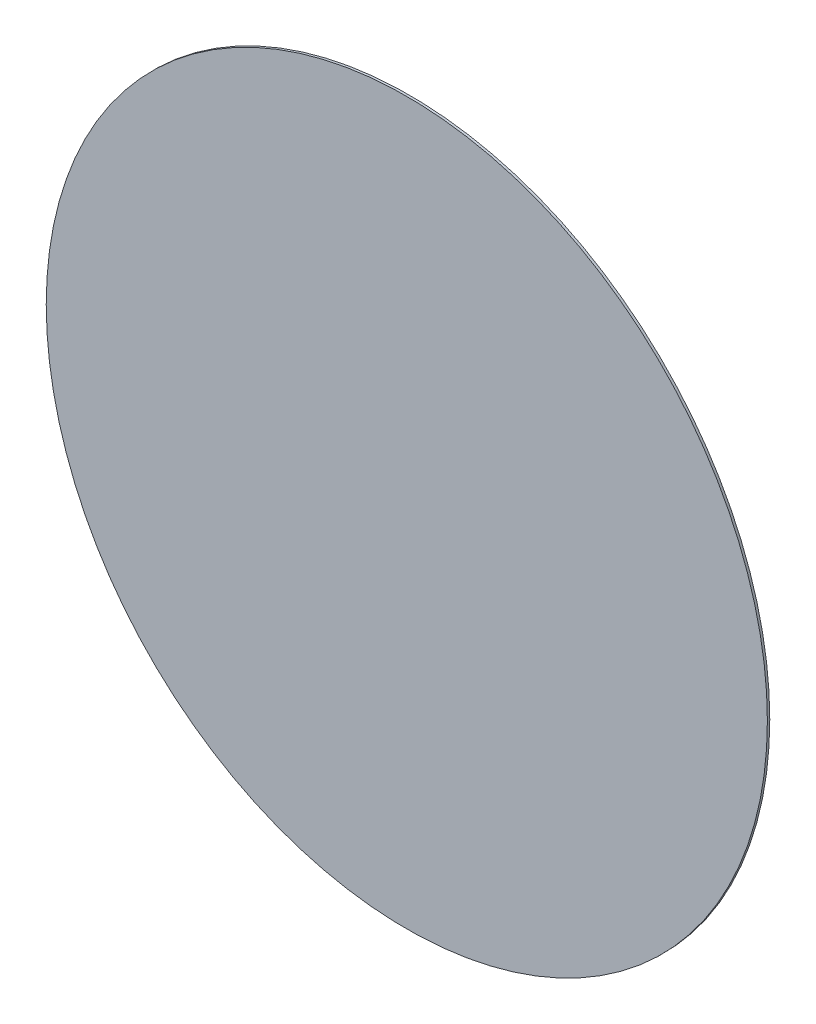
ISO-10303-21;
HEADER;
FILE_DESCRIPTION(('STEP AP214'),'2;1');
FILE_NAME('part.step','',(''),(''),'','','');
FILE_SCHEMA(('AUTOMOTIVE_DESIGN { 1 0 10303 214 1 1 1 1 }'));
ENDSEC;
DATA;
#1=APPLICATION_CONTEXT('core data for automotive mechanical design processes');
#2=APPLICATION_PROTOCOL_DEFINITION('international standard','automotive_design',2000,#1);
#3=PRODUCT_CONTEXT('',#1,'mechanical');
#4=PRODUCT('Part','Part','',(#3));
#5=PRODUCT_RELATED_PRODUCT_CATEGORY('part','',(#4));
#6=PRODUCT_DEFINITION_FORMATION('','',#4);
#7=PRODUCT_DEFINITION_CONTEXT('part definition',#1,'design');
#8=PRODUCT_DEFINITION('design','',#6,#7);
#9=PRODUCT_DEFINITION_SHAPE('','',#8);
#10=(LENGTH_UNIT() NAMED_UNIT(*) SI_UNIT(.MILLI.,.METRE.));
#11=(NAMED_UNIT(*) PLANE_ANGLE_UNIT() SI_UNIT($,.RADIAN.));
#12=(NAMED_UNIT(*) SI_UNIT($,.STERADIAN.) SOLID_ANGLE_UNIT());
#13=UNCERTAINTY_MEASURE_WITH_UNIT(LENGTH_MEASURE(1.E-05),#10,'distance_accuracy_value','');
#14=(GEOMETRIC_REPRESENTATION_CONTEXT(3) GLOBAL_UNCERTAINTY_ASSIGNED_CONTEXT((#13)) GLOBAL_UNIT_ASSIGNED_CONTEXT((#10,
#11,#12)) REPRESENTATION_CONTEXT('',''));
#15=CARTESIAN_POINT('',(0.,0.,0.));
#16=DIRECTION('',(0.,0.,1.));
#17=DIRECTION('',(1.,0.,0.));
#18=AXIS2_PLACEMENT_3D('',#15,#16,#17);
#19=CARTESIAN_POINT('',(-300.,0.,2.));
#20=DIRECTION('',(0.,0.,1.));
#21=DIRECTION('',(1.,0.,0.));
#22=AXIS2_PLACEMENT_3D('',#19,#20,#21);
#23=PLANE('',#22);
#24=CARTESIAN_POINT('',(0.,0.,2.));
#25=DIRECTION('',(0.,0.,1.));
#26=DIRECTION('',(1.,0.,0.));
#27=AXIS2_PLACEMENT_3D('',#24,#25,#26);
#28=CIRCLE('',#27,302.);
#29=CARTESIAN_POINT('',(302.,0.,2.));
#30=VERTEX_POINT('',#29);
#31=EDGE_CURVE('E44',#30,#30,#28,.F.);
#32=ORIENTED_EDGE('',*,*,#31,.F.);
#33=EDGE_LOOP('',(#32));
#34=FACE_BOUND('',#33,.T.);
#35=ADVANCED_FACE('F40',(#34),#23,.T.);
#36=CARTESIAN_POINT('',(0.,0.,0.));
#37=DIRECTION('',(0.,0.,1.));
#38=DIRECTION('',(1.,0.,0.));
#39=AXIS2_PLACEMENT_3D('',#36,#37,#38);
#40=PLANE('',#39);
#41=CARTESIAN_POINT('',(0.,0.,0.));
#42=DIRECTION('',(0.,0.,-1.));
#43=DIRECTION('',(-1.,0.,0.));
#44=AXIS2_PLACEMENT_3D('',#41,#42,#43);
#45=CIRCLE('',#44,302.);
#46=CARTESIAN_POINT('',(-302.,0.,0.));
#47=VERTEX_POINT('',#46);
#48=EDGE_CURVE('E10',#47,#47,#45,.F.);
#49=ORIENTED_EDGE('',*,*,#48,.F.);
#50=EDGE_LOOP('',(#49));
#51=FACE_BOUND('',#50,.T.);
#52=ADVANCED_FACE('F55',(#51),#40,.F.);
#53=CARTESIAN_POINT('',(0.,0.,60.));
#54=DIRECTION('',(0.,0.,-1.));
#55=DIRECTION('',(-1.,0.,0.));
#56=AXIS2_PLACEMENT_3D('',#53,#54,#55);
#57=CYLINDRICAL_SURFACE('',#56,302.);
#58=ORIENTED_EDGE('',*,*,#48,.T.);
#59=EDGE_LOOP('',(#58));
#60=FACE_BOUND('',#59,.T.);
#61=ORIENTED_EDGE('',*,*,#31,.T.);
#62=EDGE_LOOP('',(#61));
#63=FACE_BOUND('',#62,.T.);
#64=ADVANCED_FACE('F42',(#60,#63),#57,.T.);
#65=CLOSED_SHELL('',(#35,#52,#64));
#66=MANIFOLD_SOLID_BREP('B2',#65);
#67=ADVANCED_BREP_SHAPE_REPRESENTATION('',(#18,#66),#14);
#68=SHAPE_DEFINITION_REPRESENTATION(#9,#67);
ENDSEC;
END-ISO-10303-21;
